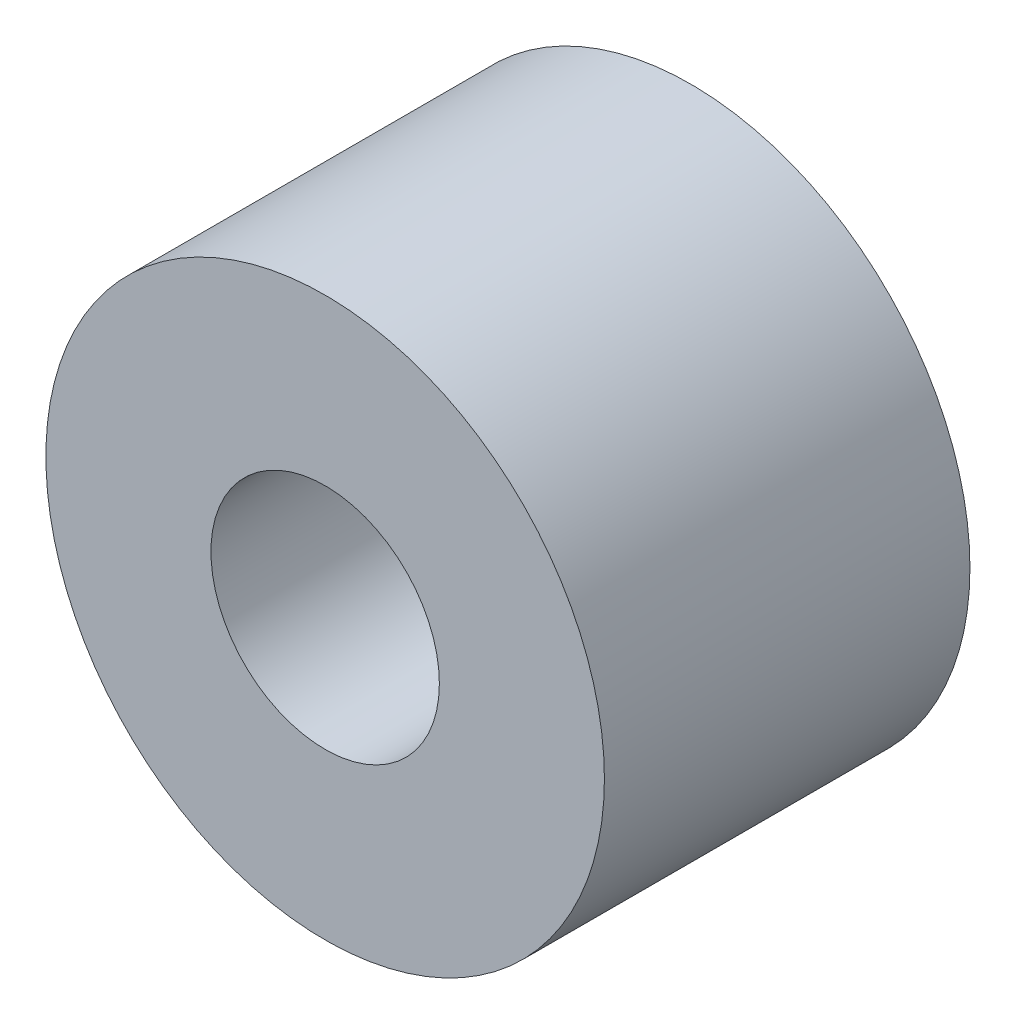
ISO-10303-21;
HEADER;
FILE_DESCRIPTION(('STEP AP214'),'2;1');
FILE_NAME('part.step','',(''),(''),'','','');
FILE_SCHEMA(('AUTOMOTIVE_DESIGN { 1 0 10303 214 1 1 1 1 }'));
ENDSEC;
DATA;
#1=APPLICATION_CONTEXT('core data for automotive mechanical design processes');
#2=APPLICATION_PROTOCOL_DEFINITION('international standard','automotive_design',2000,#1);
#3=PRODUCT_CONTEXT('',#1,'mechanical');
#4=PRODUCT('Part','Part','',(#3));
#5=PRODUCT_RELATED_PRODUCT_CATEGORY('part','',(#4));
#6=PRODUCT_DEFINITION_FORMATION('','',#4);
#7=PRODUCT_DEFINITION_CONTEXT('part definition',#1,'design');
#8=PRODUCT_DEFINITION('design','',#6,#7);
#9=PRODUCT_DEFINITION_SHAPE('','',#8);
#10=(LENGTH_UNIT() NAMED_UNIT(*) SI_UNIT(.MILLI.,.METRE.));
#11=(NAMED_UNIT(*) PLANE_ANGLE_UNIT() SI_UNIT($,.RADIAN.));
#12=(NAMED_UNIT(*) SI_UNIT($,.STERADIAN.) SOLID_ANGLE_UNIT());
#13=UNCERTAINTY_MEASURE_WITH_UNIT(LENGTH_MEASURE(1.E-05),#10,'distance_accuracy_value','');
#14=(GEOMETRIC_REPRESENTATION_CONTEXT(3) GLOBAL_UNCERTAINTY_ASSIGNED_CONTEXT((#13)) GLOBAL_UNIT_ASSIGNED_CONTEXT((#10,
#11,#12)) REPRESENTATION_CONTEXT('',''));
#15=CARTESIAN_POINT('',(0.,0.,0.));
#16=DIRECTION('',(0.,0.,1.));
#17=DIRECTION('',(1.,0.,0.));
#18=AXIS2_PLACEMENT_3D('',#15,#16,#17);
#19=CARTESIAN_POINT('',(300.,300.,342.));
#20=DIRECTION('',(0.,0.,1.));
#21=DIRECTION('',(1.,0.,0.));
#22=AXIS2_PLACEMENT_3D('',#19,#20,#21);
#23=PLANE('',#22);
#24=CARTESIAN_POINT('',(300.,300.,342.));
#25=DIRECTION('',(0.,0.,1.));
#26=DIRECTION('',(1.,0.,0.));
#27=AXIS2_PLACEMENT_3D('',#24,#25,#26);
#28=CIRCLE('',#27,6.11219772367583);
#29=CARTESIAN_POINT('',(306.112197723676,300.,342.));
#30=VERTEX_POINT('',#29);
#31=EDGE_CURVE('E10',#30,#30,#28,.T.);
#32=ORIENTED_EDGE('',*,*,#31,.T.);
#33=EDGE_LOOP('',(#32));
#34=FACE_BOUND('',#33,.T.);
#35=CARTESIAN_POINT('',(300.,300.,342.));
#36=DIRECTION('',(0.,0.,1.));
#37=DIRECTION('',(1.,0.,0.));
#38=AXIS2_PLACEMENT_3D('',#35,#36,#37);
#39=CIRCLE('',#38,2.5);
#40=CARTESIAN_POINT('',(302.5,300.,342.));
#41=VERTEX_POINT('',#40);
#42=EDGE_CURVE('E48',#41,#41,#39,.T.);
#43=ORIENTED_EDGE('',*,*,#42,.F.);
#44=EDGE_LOOP('',(#43));
#45=FACE_BOUND('',#44,.T.);
#46=ADVANCED_FACE('F37',(#34,#45),#23,.T.);
#47=CARTESIAN_POINT('',(300.,300.,334.));
#48=DIRECTION('',(0.,0.,1.));
#49=DIRECTION('',(1.,0.,0.));
#50=AXIS2_PLACEMENT_3D('',#47,#48,#49);
#51=PLANE('',#50);
#52=CARTESIAN_POINT('',(300.,300.,334.));
#53=DIRECTION('',(0.,0.,1.));
#54=DIRECTION('',(1.,0.,0.));
#55=AXIS2_PLACEMENT_3D('',#52,#53,#54);
#56=CIRCLE('',#55,6.11219772367583);
#57=CARTESIAN_POINT('',(306.112197723676,300.,334.));
#58=VERTEX_POINT('',#57);
#59=EDGE_CURVE('E41',#58,#58,#56,.T.);
#60=ORIENTED_EDGE('',*,*,#59,.F.);
#61=EDGE_LOOP('',(#60));
#62=FACE_BOUND('',#61,.T.);
#63=CARTESIAN_POINT('',(300.,300.,334.));
#64=DIRECTION('',(0.,0.,1.));
#65=DIRECTION('',(1.,0.,0.));
#66=AXIS2_PLACEMENT_3D('',#63,#64,#65);
#67=CIRCLE('',#66,2.5);
#68=CARTESIAN_POINT('',(302.5,300.,334.));
#69=VERTEX_POINT('',#68);
#70=EDGE_CURVE('E50',#69,#69,#67,.T.);
#71=ORIENTED_EDGE('',*,*,#70,.T.);
#72=EDGE_LOOP('',(#71));
#73=FACE_BOUND('',#72,.T.);
#74=ADVANCED_FACE('F60',(#62,#73),#51,.F.);
#75=CARTESIAN_POINT('',(300.,300.,342.));
#76=DIRECTION('',(0.,0.,-1.));
#77=DIRECTION('',(-1.,0.,0.));
#78=AXIS2_PLACEMENT_3D('',#75,#76,#77);
#79=CYLINDRICAL_SURFACE('',#78,6.11219772367583);
#80=ORIENTED_EDGE('',*,*,#31,.F.);
#81=EDGE_LOOP('',(#80));
#82=FACE_BOUND('',#81,.T.);
#83=ORIENTED_EDGE('',*,*,#59,.T.);
#84=EDGE_LOOP('',(#83));
#85=FACE_BOUND('',#84,.T.);
#86=ADVANCED_FACE('F39',(#82,#85),#79,.T.);
#87=CARTESIAN_POINT('',(300.,300.,342.));
#88=DIRECTION('',(0.,0.,-1.));
#89=DIRECTION('',(-1.,0.,0.));
#90=AXIS2_PLACEMENT_3D('',#87,#88,#89);
#91=CYLINDRICAL_SURFACE('',#90,2.5);
#92=ORIENTED_EDGE('',*,*,#42,.T.);
#93=EDGE_LOOP('',(#92));
#94=FACE_BOUND('',#93,.T.);
#95=ORIENTED_EDGE('',*,*,#70,.F.);
#96=EDGE_LOOP('',(#95));
#97=FACE_BOUND('',#96,.T.);
#98=ADVANCED_FACE('F56',(#94,#97),#91,.F.);
#99=CLOSED_SHELL('',(#46,#74,#86,#98));
#100=MANIFOLD_SOLID_BREP('B2',#99);
#101=ADVANCED_BREP_SHAPE_REPRESENTATION('',(#18,#100),#14);
#102=SHAPE_DEFINITION_REPRESENTATION(#9,#101);
ENDSEC;
END-ISO-10303-21;
